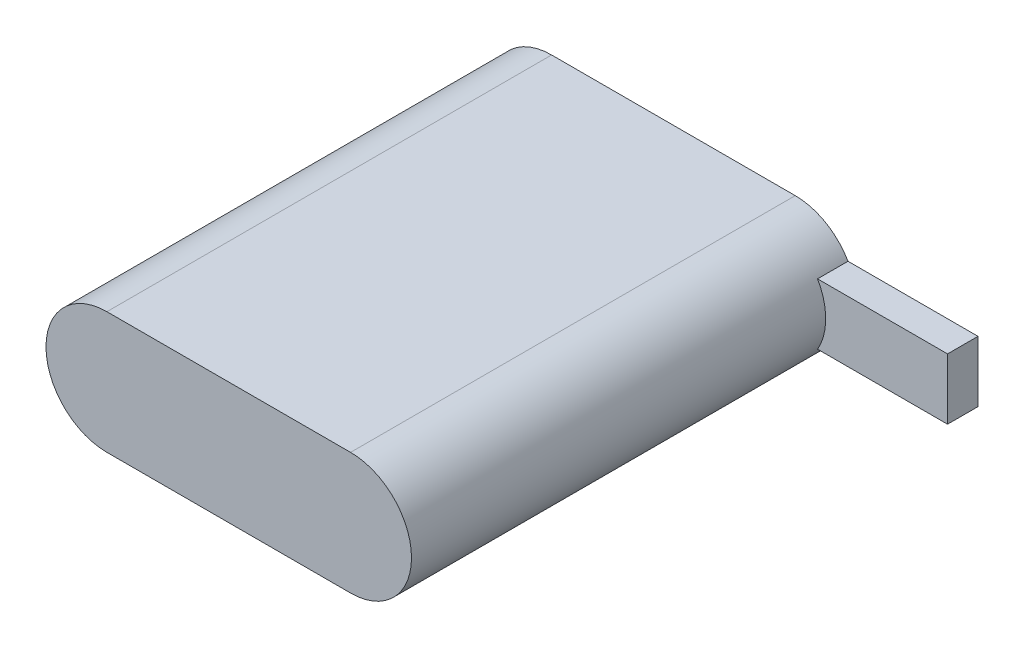
ISO-10303-21;
HEADER;
FILE_DESCRIPTION(('STEP AP214'),'2;1');
FILE_NAME('part.step','',(''),(''),'','','');
FILE_SCHEMA(('AUTOMOTIVE_DESIGN { 1 0 10303 214 1 1 1 1 }'));
ENDSEC;
DATA;
#1=APPLICATION_CONTEXT('core data for automotive mechanical design processes');
#2=APPLICATION_PROTOCOL_DEFINITION('international standard','automotive_design',2000,#1);
#3=PRODUCT_CONTEXT('',#1,'mechanical');
#4=PRODUCT('Part','Part','',(#3));
#5=PRODUCT_RELATED_PRODUCT_CATEGORY('part','',(#4));
#6=PRODUCT_DEFINITION_FORMATION('','',#4);
#7=PRODUCT_DEFINITION_CONTEXT('part definition',#1,'design');
#8=PRODUCT_DEFINITION('design','',#6,#7);
#9=PRODUCT_DEFINITION_SHAPE('','',#8);
#10=(LENGTH_UNIT() NAMED_UNIT(*) SI_UNIT(.MILLI.,.METRE.));
#11=(NAMED_UNIT(*) PLANE_ANGLE_UNIT() SI_UNIT($,.RADIAN.));
#12=(NAMED_UNIT(*) SI_UNIT($,.STERADIAN.) SOLID_ANGLE_UNIT());
#13=UNCERTAINTY_MEASURE_WITH_UNIT(LENGTH_MEASURE(1.E-05),#10,'distance_accuracy_value','');
#14=(GEOMETRIC_REPRESENTATION_CONTEXT(3) GLOBAL_UNCERTAINTY_ASSIGNED_CONTEXT((#13)) GLOBAL_UNIT_ASSIGNED_CONTEXT((#10,
#11,#12)) REPRESENTATION_CONTEXT('',''));
#15=CARTESIAN_POINT('',(0.,0.,0.));
#16=DIRECTION('',(0.,0.,1.));
#17=DIRECTION('',(1.,0.,0.));
#18=AXIS2_PLACEMENT_3D('',#15,#16,#17);
#19=CARTESIAN_POINT('',(20.,0.,73.));
#20=DIRECTION('',(0.,0.,-1.));
#21=DIRECTION('',(-1.,0.,0.));
#22=AXIS2_PLACEMENT_3D('',#19,#20,#21);
#23=CYLINDRICAL_SURFACE('',#22,10.);
#24=DIRECTION('',(0.,0.,-1.));
#25=VECTOR('',#24,1.);
#26=CARTESIAN_POINT('',(28.6602540378444,-5.,73.));
#27=LINE('',#26,#25);
#28=CARTESIAN_POINT('',(28.6602540378444,-5.,5.));
#29=VERTEX_POINT('',#28);
#30=CARTESIAN_POINT('',(28.6602540378444,-5.,0.));
#31=VERTEX_POINT('',#30);
#32=EDGE_CURVE('E47',#29,#31,#27,.T.);
#33=ORIENTED_EDGE('',*,*,#32,.F.);
#34=CARTESIAN_POINT('',(20.,0.,5.));
#35=DIRECTION('',(0.,0.,-1.));
#36=DIRECTION('',(-1.,0.,0.));
#37=AXIS2_PLACEMENT_3D('',#34,#35,#36);
#38=CIRCLE('',#37,10.);
#39=CARTESIAN_POINT('',(28.6602540378444,5.,5.));
#40=VERTEX_POINT('',#39);
#41=EDGE_CURVE('E11',#40,#29,#38,.T.);
#42=ORIENTED_EDGE('',*,*,#41,.F.);
#43=DIRECTION('',(0.,0.,-1.));
#44=VECTOR('',#43,1.);
#45=CARTESIAN_POINT('',(28.6602540378444,5.00000000000001,73.));
#46=LINE('',#45,#44);
#47=CARTESIAN_POINT('',(28.6602540378444,5.,0.));
#48=VERTEX_POINT('',#47);
#49=EDGE_CURVE('E52',#48,#40,#46,.F.);
#50=ORIENTED_EDGE('',*,*,#49,.F.);
#51=CARTESIAN_POINT('',(20.,0.,0.));
#52=DIRECTION('',(0.,0.,1.));
#53=DIRECTION('',(-1.,0.,0.));
#54=AXIS2_PLACEMENT_3D('',#51,#52,#53);
#55=CIRCLE('',#54,10.);
#56=CARTESIAN_POINT('',(20.,10.,0.));
#57=VERTEX_POINT('',#56);
#58=EDGE_CURVE('E139',#48,#57,#55,.T.);
#59=ORIENTED_EDGE('',*,*,#58,.T.);
#60=DIRECTION('',(0.,0.,-1.));
#61=VECTOR('',#60,1.);
#62=CARTESIAN_POINT('',(20.,10.,73.));
#63=LINE('',#62,#61);
#64=CARTESIAN_POINT('',(20.,10.,73.));
#65=VERTEX_POINT('',#64);
#66=EDGE_CURVE('E145',#65,#57,#63,.T.);
#67=ORIENTED_EDGE('',*,*,#66,.F.);
#68=CARTESIAN_POINT('',(20.,0.,73.));
#69=DIRECTION('',(0.,0.,1.));
#70=DIRECTION('',(-1.,0.,0.));
#71=AXIS2_PLACEMENT_3D('',#68,#69,#70);
#72=CIRCLE('',#71,10.);
#73=CARTESIAN_POINT('',(20.,-10.,73.));
#74=VERTEX_POINT('',#73);
#75=EDGE_CURVE('E130',#74,#65,#72,.T.);
#76=ORIENTED_EDGE('',*,*,#75,.F.);
#77=DIRECTION('',(0.,0.,-1.));
#78=VECTOR('',#77,1.);
#79=CARTESIAN_POINT('',(20.,-10.,73.));
#80=LINE('',#79,#78);
#81=CARTESIAN_POINT('',(20.,-10.,0.));
#82=VERTEX_POINT('',#81);
#83=EDGE_CURVE('E148',#74,#82,#80,.T.);
#84=ORIENTED_EDGE('',*,*,#83,.T.);
#85=EDGE_CURVE('E140',#82,#31,#55,.T.);
#86=ORIENTED_EDGE('',*,*,#85,.T.);
#87=EDGE_LOOP('',(#33,#42,#50,#59,#67,#76,#84,#86));
#88=FACE_BOUND('',#87,.T.);
#89=ADVANCED_FACE('F32',(#88),#23,.T.);
#90=CARTESIAN_POINT('',(-20.,0.,73.));
#91=DIRECTION('',(0.,0.,-1.));
#92=DIRECTION('',(-1.,0.,0.));
#93=AXIS2_PLACEMENT_3D('',#90,#91,#92);
#94=CYLINDRICAL_SURFACE('',#93,10.);
#95=CARTESIAN_POINT('',(-20.,0.,0.));
#96=DIRECTION('',(0.,0.,1.));
#97=DIRECTION('',(1.,0.,0.));
#98=AXIS2_PLACEMENT_3D('',#95,#96,#97);
#99=CIRCLE('',#98,10.);
#100=CARTESIAN_POINT('',(-20.,10.,0.));
#101=VERTEX_POINT('',#100);
#102=CARTESIAN_POINT('',(-20.,-10.,0.));
#103=VERTEX_POINT('',#102);
#104=EDGE_CURVE('E123',#101,#103,#99,.T.);
#105=ORIENTED_EDGE('',*,*,#104,.T.);
#106=DIRECTION('',(0.,0.,-1.));
#107=VECTOR('',#106,1.);
#108=CARTESIAN_POINT('',(-20.,-10.,73.));
#109=LINE('',#108,#107);
#110=CARTESIAN_POINT('',(-20.,-10.,73.));
#111=VERTEX_POINT('',#110);
#112=EDGE_CURVE('E40',#111,#103,#109,.T.);
#113=ORIENTED_EDGE('',*,*,#112,.F.);
#114=CARTESIAN_POINT('',(-20.,0.,73.));
#115=DIRECTION('',(0.,0.,1.));
#116=DIRECTION('',(1.,0.,0.));
#117=AXIS2_PLACEMENT_3D('',#114,#115,#116);
#118=CIRCLE('',#117,10.);
#119=CARTESIAN_POINT('',(-20.,10.,73.));
#120=VERTEX_POINT('',#119);
#121=EDGE_CURVE('E124',#120,#111,#118,.T.);
#122=ORIENTED_EDGE('',*,*,#121,.F.);
#123=DIRECTION('',(0.,0.,-1.));
#124=VECTOR('',#123,1.);
#125=CARTESIAN_POINT('',(-20.,10.,73.));
#126=LINE('',#125,#124);
#127=EDGE_CURVE('E134',#120,#101,#126,.T.);
#128=ORIENTED_EDGE('',*,*,#127,.T.);
#129=EDGE_LOOP('',(#105,#113,#122,#128));
#130=FACE_BOUND('',#129,.T.);
#131=ADVANCED_FACE('F34',(#130),#94,.T.);
#132=CARTESIAN_POINT('',(-20.,-10.,73.));
#133=DIRECTION('',(0.,1.,0.));
#134=DIRECTION('',(0.,0.,1.));
#135=AXIS2_PLACEMENT_3D('',#132,#133,#134);
#136=PLANE('',#135);
#137=DIRECTION('',(1.,0.,0.));
#138=VECTOR('',#137,1.);
#139=CARTESIAN_POINT('',(-20.,-10.,0.));
#140=LINE('',#139,#138);
#141=EDGE_CURVE('E137',#103,#82,#140,.T.);
#142=ORIENTED_EDGE('',*,*,#141,.T.);
#143=ORIENTED_EDGE('',*,*,#83,.F.);
#144=DIRECTION('',(1.,0.,0.));
#145=VECTOR('',#144,1.);
#146=CARTESIAN_POINT('',(-20.,-10.,73.));
#147=LINE('',#146,#145);
#148=EDGE_CURVE('E127',#111,#74,#147,.T.);
#149=ORIENTED_EDGE('',*,*,#148,.F.);
#150=ORIENTED_EDGE('',*,*,#112,.T.);
#151=EDGE_LOOP('',(#142,#143,#149,#150));
#152=FACE_BOUND('',#151,.T.);
#153=ADVANCED_FACE('F153',(#152),#136,.F.);
#154=CARTESIAN_POINT('',(20.,10.,73.));
#155=DIRECTION('',(0.,-1.,0.));
#156=DIRECTION('',(0.,0.,-1.));
#157=AXIS2_PLACEMENT_3D('',#154,#155,#156);
#158=PLANE('',#157);
#159=DIRECTION('',(-1.,0.,0.));
#160=VECTOR('',#159,1.);
#161=CARTESIAN_POINT('',(20.,10.,0.));
#162=LINE('',#161,#160);
#163=EDGE_CURVE('E128',#57,#101,#162,.T.);
#164=ORIENTED_EDGE('',*,*,#163,.T.);
#165=ORIENTED_EDGE('',*,*,#127,.F.);
#166=DIRECTION('',(-1.,0.,0.));
#167=VECTOR('',#166,1.);
#168=CARTESIAN_POINT('',(20.,10.,73.));
#169=LINE('',#168,#167);
#170=EDGE_CURVE('E132',#65,#120,#169,.T.);
#171=ORIENTED_EDGE('',*,*,#170,.F.);
#172=ORIENTED_EDGE('',*,*,#66,.T.);
#173=EDGE_LOOP('',(#164,#165,#171,#172));
#174=FACE_BOUND('',#173,.T.);
#175=ADVANCED_FACE('F169',(#174),#158,.F.);
#176=CARTESIAN_POINT('',(-20.,0.,73.));
#177=DIRECTION('',(0.,0.,1.));
#178=DIRECTION('',(1.,0.,0.));
#179=AXIS2_PLACEMENT_3D('',#176,#177,#178);
#180=PLANE('',#179);
#181=ORIENTED_EDGE('',*,*,#121,.T.);
#182=ORIENTED_EDGE('',*,*,#148,.T.);
#183=ORIENTED_EDGE('',*,*,#75,.T.);
#184=ORIENTED_EDGE('',*,*,#170,.T.);
#185=EDGE_LOOP('',(#181,#182,#183,#184));
#186=FACE_BOUND('',#185,.T.);
#187=ADVANCED_FACE('F167',(#186),#180,.T.);
#188=CARTESIAN_POINT('',(-20.,0.,0.));
#189=DIRECTION('',(0.,0.,1.));
#190=DIRECTION('',(1.,0.,0.));
#191=AXIS2_PLACEMENT_3D('',#188,#189,#190);
#192=PLANE('',#191);
#193=ORIENTED_EDGE('',*,*,#58,.F.);
#194=DIRECTION('',(-1.,0.,0.));
#195=VECTOR('',#194,1.);
#196=CARTESIAN_POINT('',(50.,5.,0.));
#197=LINE('',#196,#195);
#198=CARTESIAN_POINT('',(50.,5.,0.));
#199=VERTEX_POINT('',#198);
#200=EDGE_CURVE('E118',#199,#48,#197,.T.);
#201=ORIENTED_EDGE('',*,*,#200,.F.);
#202=DIRECTION('',(0.,1.,0.));
#203=VECTOR('',#202,1.);
#204=CARTESIAN_POINT('',(50.,5.,0.));
#205=LINE('',#204,#203);
#206=CARTESIAN_POINT('',(50.,-5.,0.));
#207=VERTEX_POINT('',#206);
#208=EDGE_CURVE('E104',#207,#199,#205,.T.);
#209=ORIENTED_EDGE('',*,*,#208,.F.);
#210=DIRECTION('',(-1.,0.,0.));
#211=VECTOR('',#210,1.);
#212=CARTESIAN_POINT('',(50.,-5.,0.));
#213=LINE('',#212,#211);
#214=EDGE_CURVE('E101',#207,#31,#213,.T.);
#215=ORIENTED_EDGE('',*,*,#214,.T.);
#216=ORIENTED_EDGE('',*,*,#85,.F.);
#217=ORIENTED_EDGE('',*,*,#141,.F.);
#218=ORIENTED_EDGE('',*,*,#104,.F.);
#219=ORIENTED_EDGE('',*,*,#163,.F.);
#220=EDGE_LOOP('',(#193,#201,#209,#215,#216,#217,#218,#219));
#221=FACE_BOUND('',#220,.T.);
#222=ADVANCED_FACE('F161',(#221),#192,.F.);
#223=CARTESIAN_POINT('',(50.,-5.,5.));
#224=DIRECTION('',(0.,1.,0.));
#225=DIRECTION('',(0.,0.,1.));
#226=AXIS2_PLACEMENT_3D('',#223,#224,#225);
#227=PLANE('',#226);
#228=DIRECTION('',(-1.,0.,0.));
#229=VECTOR('',#228,1.);
#230=CARTESIAN_POINT('',(50.,-5.,5.));
#231=LINE('',#230,#229);
#232=CARTESIAN_POINT('',(50.,-5.,5.));
#233=VERTEX_POINT('',#232);
#234=EDGE_CURVE('E99',#233,#29,#231,.T.);
#235=ORIENTED_EDGE('',*,*,#234,.T.);
#236=ORIENTED_EDGE('',*,*,#32,.T.);
#237=ORIENTED_EDGE('',*,*,#214,.F.);
#238=DIRECTION('',(0.,0.,-1.));
#239=VECTOR('',#238,1.);
#240=CARTESIAN_POINT('',(50.,-5.,5.));
#241=LINE('',#240,#239);
#242=EDGE_CURVE('E95',#233,#207,#241,.T.);
#243=ORIENTED_EDGE('',*,*,#242,.F.);
#244=EDGE_LOOP('',(#235,#236,#237,#243));
#245=FACE_BOUND('',#244,.T.);
#246=ADVANCED_FACE('F97',(#245),#227,.F.);
#247=CARTESIAN_POINT('',(50.,5.,5.));
#248=DIRECTION('',(0.,-1.,0.));
#249=DIRECTION('',(0.,0.,-1.));
#250=AXIS2_PLACEMENT_3D('',#247,#248,#249);
#251=PLANE('',#250);
#252=ORIENTED_EDGE('',*,*,#200,.T.);
#253=ORIENTED_EDGE('',*,*,#49,.T.);
#254=DIRECTION('',(-1.,0.,0.));
#255=VECTOR('',#254,1.);
#256=CARTESIAN_POINT('',(50.,5.,5.));
#257=LINE('',#256,#255);
#258=CARTESIAN_POINT('',(50.,5.,5.));
#259=VERTEX_POINT('',#258);
#260=EDGE_CURVE('E251',#259,#40,#257,.T.);
#261=ORIENTED_EDGE('',*,*,#260,.F.);
#262=DIRECTION('',(0.,0.,1.));
#263=VECTOR('',#262,1.);
#264=CARTESIAN_POINT('',(50.,5.,5.));
#265=LINE('',#264,#263);
#266=EDGE_CURVE('E110',#199,#259,#265,.T.);
#267=ORIENTED_EDGE('',*,*,#266,.F.);
#268=EDGE_LOOP('',(#252,#253,#261,#267));
#269=FACE_BOUND('',#268,.T.);
#270=ADVANCED_FACE('F220',(#269),#251,.F.);
#271=CARTESIAN_POINT('',(50.,5.,5.));
#272=DIRECTION('',(0.,0.,-1.));
#273=DIRECTION('',(-1.,0.,0.));
#274=AXIS2_PLACEMENT_3D('',#271,#272,#273);
#275=PLANE('',#274);
#276=ORIENTED_EDGE('',*,*,#260,.T.);
#277=ORIENTED_EDGE('',*,*,#41,.T.);
#278=ORIENTED_EDGE('',*,*,#234,.F.);
#279=DIRECTION('',(0.,-1.,0.));
#280=VECTOR('',#279,1.);
#281=CARTESIAN_POINT('',(50.,5.,5.));
#282=LINE('',#281,#280);
#283=EDGE_CURVE('E105',#259,#233,#282,.T.);
#284=ORIENTED_EDGE('',*,*,#283,.F.);
#285=EDGE_LOOP('',(#276,#277,#278,#284));
#286=FACE_BOUND('',#285,.T.);
#287=ADVANCED_FACE('F115',(#286),#275,.F.);
#288=CARTESIAN_POINT('',(50.,0.,0.));
#289=DIRECTION('',(1.,0.,0.));
#290=DIRECTION('',(0.,0.,-1.));
#291=AXIS2_PLACEMENT_3D('',#288,#289,#290);
#292=PLANE('',#291);
#293=ORIENTED_EDGE('',*,*,#283,.T.);
#294=ORIENTED_EDGE('',*,*,#242,.T.);
#295=ORIENTED_EDGE('',*,*,#208,.T.);
#296=ORIENTED_EDGE('',*,*,#266,.T.);
#297=EDGE_LOOP('',(#293,#294,#295,#296));
#298=FACE_BOUND('',#297,.T.);
#299=ADVANCED_FACE('F108',(#298),#292,.T.);
#300=CLOSED_SHELL('',(#89,#131,#153,#175,#187,#222,#246,#270,#287,#299));
#301=MANIFOLD_SOLID_BREP('B2',#300);
#302=ADVANCED_BREP_SHAPE_REPRESENTATION('',(#18,#301),#14);
#303=SHAPE_DEFINITION_REPRESENTATION(#9,#302);
ENDSEC;
END-ISO-10303-21;
